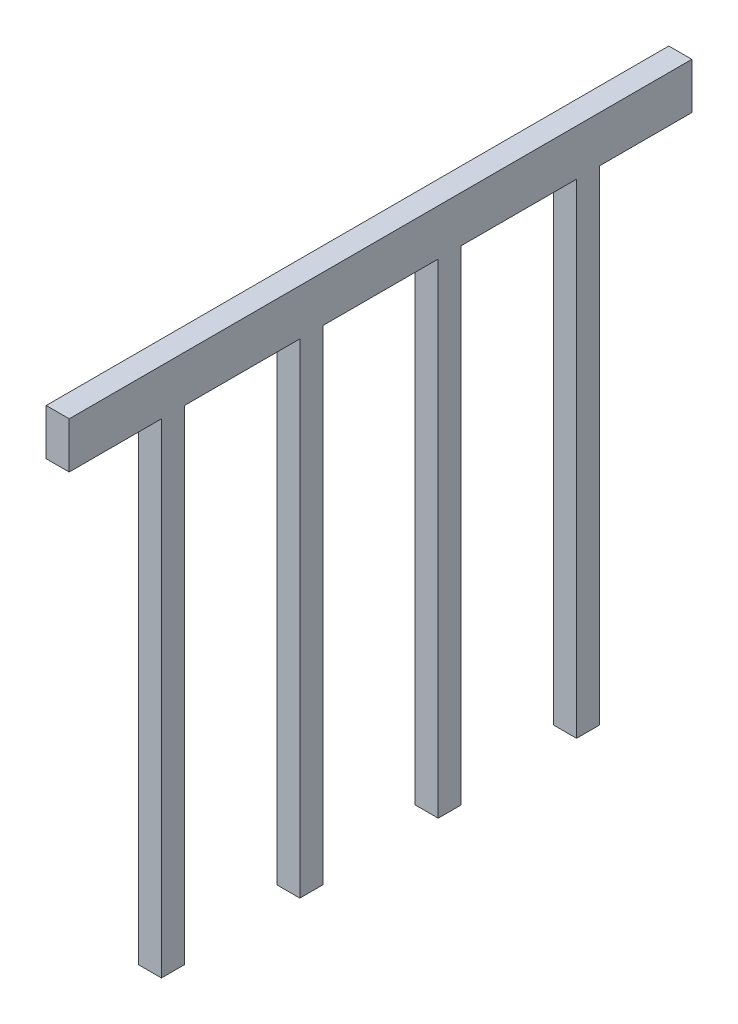
ISO-10303-21;
HEADER;
FILE_DESCRIPTION(('STEP AP214'),'2;1');
FILE_NAME('part.step','',(''),(''),'','','');
FILE_SCHEMA(('AUTOMOTIVE_DESIGN { 1 0 10303 214 1 1 1 1 }'));
ENDSEC;
DATA;
#1=APPLICATION_CONTEXT('core data for automotive mechanical design processes');
#2=APPLICATION_PROTOCOL_DEFINITION('international standard','automotive_design',2000,#1);
#3=PRODUCT_CONTEXT('',#1,'mechanical');
#4=PRODUCT('Part','Part','',(#3));
#5=PRODUCT_RELATED_PRODUCT_CATEGORY('part','',(#4));
#6=PRODUCT_DEFINITION_FORMATION('','',#4);
#7=PRODUCT_DEFINITION_CONTEXT('part definition',#1,'design');
#8=PRODUCT_DEFINITION('design','',#6,#7);
#9=PRODUCT_DEFINITION_SHAPE('','',#8);
#10=(LENGTH_UNIT() NAMED_UNIT(*) SI_UNIT(.MILLI.,.METRE.));
#11=(NAMED_UNIT(*) PLANE_ANGLE_UNIT() SI_UNIT($,.RADIAN.));
#12=(NAMED_UNIT(*) SI_UNIT($,.STERADIAN.) SOLID_ANGLE_UNIT());
#13=UNCERTAINTY_MEASURE_WITH_UNIT(LENGTH_MEASURE(1.E-05),#10,'distance_accuracy_value','');
#14=(GEOMETRIC_REPRESENTATION_CONTEXT(3) GLOBAL_UNCERTAINTY_ASSIGNED_CONTEXT((#13)) GLOBAL_UNIT_ASSIGNED_CONTEXT((#10,
#11,#12)) REPRESENTATION_CONTEXT('',''));
#15=CARTESIAN_POINT('',(0.,0.,0.));
#16=DIRECTION('',(0.,0.,1.));
#17=DIRECTION('',(1.,0.,0.));
#18=AXIS2_PLACEMENT_3D('',#15,#16,#17);
#19=CARTESIAN_POINT('',(25.4,584.2,342.9));
#20=DIRECTION('',(0.,0.,-1.));
#21=DIRECTION('',(0.,1.,0.));
#22=AXIS2_PLACEMENT_3D('',#19,#20,#21);
#23=PLANE('',#22);
#24=DIRECTION('',(0.,-1.,0.));
#25=VECTOR('',#24,1.);
#26=CARTESIAN_POINT('',(0.,584.2,342.9));
#27=LINE('',#26,#25);
#28=CARTESIAN_POINT('',(0.,584.2,342.9));
#29=VERTEX_POINT('',#28);
#30=CARTESIAN_POINT('',(0.,533.4,342.9));
#31=VERTEX_POINT('',#30);
#32=EDGE_CURVE('E200',#29,#31,#27,.T.);
#33=ORIENTED_EDGE('',*,*,#32,.T.);
#34=DIRECTION('',(-1.,0.,0.));
#35=VECTOR('',#34,1.);
#36=CARTESIAN_POINT('',(25.4,533.4,342.9));
#37=LINE('',#36,#35);
#38=CARTESIAN_POINT('',(25.4,533.4,342.9));
#39=VERTEX_POINT('',#38);
#40=EDGE_CURVE('E11',#39,#31,#37,.T.);
#41=ORIENTED_EDGE('',*,*,#40,.F.);
#42=DIRECTION('',(0.,-1.,0.));
#43=VECTOR('',#42,1.);
#44=CARTESIAN_POINT('',(25.4,584.2,342.9));
#45=LINE('',#44,#43);
#46=CARTESIAN_POINT('',(25.4,584.2,342.9));
#47=VERTEX_POINT('',#46);
#48=EDGE_CURVE('E238',#47,#39,#45,.T.);
#49=ORIENTED_EDGE('',*,*,#48,.F.);
#50=DIRECTION('',(-1.,0.,0.));
#51=VECTOR('',#50,1.);
#52=CARTESIAN_POINT('',(25.4,584.2,342.9));
#53=LINE('',#52,#51);
#54=EDGE_CURVE('E196',#47,#29,#53,.T.);
#55=ORIENTED_EDGE('',*,*,#54,.T.);
#56=EDGE_LOOP('',(#33,#41,#49,#55));
#57=FACE_BOUND('',#56,.T.);
#58=ADVANCED_FACE('F32',(#57),#23,.F.);
#59=CARTESIAN_POINT('',(25.4,533.4,342.9));
#60=DIRECTION('',(0.,1.,0.));
#61=DIRECTION('',(0.,0.,1.));
#62=AXIS2_PLACEMENT_3D('',#59,#60,#61);
#63=PLANE('',#62);
#64=DIRECTION('',(0.,0.,-1.));
#65=VECTOR('',#64,1.);
#66=CARTESIAN_POINT('',(0.,533.4,342.9));
#67=LINE('',#66,#65);
#68=CARTESIAN_POINT('',(0.,533.4,241.3));
#69=VERTEX_POINT('',#68);
#70=EDGE_CURVE('E203',#31,#69,#67,.T.);
#71=ORIENTED_EDGE('',*,*,#70,.T.);
#72=DIRECTION('',(-1.,0.,0.));
#73=VECTOR('',#72,1.);
#74=CARTESIAN_POINT('',(25.4,533.4,241.3));
#75=LINE('',#74,#73);
#76=CARTESIAN_POINT('',(25.4,533.4,241.3));
#77=VERTEX_POINT('',#76);
#78=EDGE_CURVE('E40',#77,#69,#75,.T.);
#79=ORIENTED_EDGE('',*,*,#78,.F.);
#80=DIRECTION('',(0.,0.,-1.));
#81=VECTOR('',#80,1.);
#82=CARTESIAN_POINT('',(25.4,533.4,342.9));
#83=LINE('',#82,#81);
#84=EDGE_CURVE('E127',#39,#77,#83,.T.);
#85=ORIENTED_EDGE('',*,*,#84,.F.);
#86=ORIENTED_EDGE('',*,*,#40,.T.);
#87=EDGE_LOOP('',(#71,#79,#85,#86));
#88=FACE_BOUND('',#87,.T.);
#89=ADVANCED_FACE('F356',(#88),#63,.F.);
#90=CARTESIAN_POINT('',(25.4,533.4,241.3));
#91=DIRECTION('',(0.,0.,-1.));
#92=DIRECTION('',(-1.,0.,0.));
#93=AXIS2_PLACEMENT_3D('',#90,#91,#92);
#94=PLANE('',#93);
#95=DIRECTION('',(0.,-1.,0.));
#96=VECTOR('',#95,1.);
#97=CARTESIAN_POINT('',(0.,533.4,241.3));
#98=LINE('',#97,#96);
#99=CARTESIAN_POINT('',(0.,0.,241.3));
#100=VERTEX_POINT('',#99);
#101=EDGE_CURVE('E205',#69,#100,#98,.T.);
#102=ORIENTED_EDGE('',*,*,#101,.T.);
#103=DIRECTION('',(-1.,0.,0.));
#104=VECTOR('',#103,1.);
#105=CARTESIAN_POINT('',(25.4,0.,241.3));
#106=LINE('',#105,#104);
#107=CARTESIAN_POINT('',(25.4,0.,241.3));
#108=VERTEX_POINT('',#107);
#109=EDGE_CURVE('E281',#108,#100,#106,.T.);
#110=ORIENTED_EDGE('',*,*,#109,.F.);
#111=DIRECTION('',(0.,-1.,0.));
#112=VECTOR('',#111,1.);
#113=CARTESIAN_POINT('',(25.4,533.4,241.3));
#114=LINE('',#113,#112);
#115=EDGE_CURVE('E289',#77,#108,#114,.T.);
#116=ORIENTED_EDGE('',*,*,#115,.F.);
#117=ORIENTED_EDGE('',*,*,#78,.T.);
#118=EDGE_LOOP('',(#102,#110,#116,#117));
#119=FACE_BOUND('',#118,.T.);
#120=ADVANCED_FACE('F287',(#119),#94,.F.);
#121=CARTESIAN_POINT('',(25.4,0.,241.3));
#122=DIRECTION('',(0.,1.,0.));
#123=DIRECTION('',(0.,0.,1.));
#124=AXIS2_PLACEMENT_3D('',#121,#122,#123);
#125=PLANE('',#124);
#126=DIRECTION('',(0.,0.,-1.));
#127=VECTOR('',#126,1.);
#128=CARTESIAN_POINT('',(0.,0.,241.3));
#129=LINE('',#128,#127);
#130=CARTESIAN_POINT('',(0.,0.,215.9));
#131=VERTEX_POINT('',#130);
#132=EDGE_CURVE('E207',#100,#131,#129,.T.);
#133=ORIENTED_EDGE('',*,*,#132,.T.);
#134=DIRECTION('',(-1.,0.,0.));
#135=VECTOR('',#134,1.);
#136=CARTESIAN_POINT('',(25.4,0.,215.9));
#137=LINE('',#136,#135);
#138=CARTESIAN_POINT('',(25.4,0.,215.9));
#139=VERTEX_POINT('',#138);
#140=EDGE_CURVE('E278',#139,#131,#137,.T.);
#141=ORIENTED_EDGE('',*,*,#140,.F.);
#142=DIRECTION('',(0.,0.,-1.));
#143=VECTOR('',#142,1.);
#144=CARTESIAN_POINT('',(25.4,0.,241.3));
#145=LINE('',#144,#143);
#146=EDGE_CURVE('E307',#108,#139,#145,.T.);
#147=ORIENTED_EDGE('',*,*,#146,.F.);
#148=ORIENTED_EDGE('',*,*,#109,.T.);
#149=EDGE_LOOP('',(#133,#141,#147,#148));
#150=FACE_BOUND('',#149,.T.);
#151=ADVANCED_FACE('F298',(#150),#125,.F.);
#152=CARTESIAN_POINT('',(25.4,533.4,215.9));
#153=DIRECTION('',(0.,0.,1.));
#154=DIRECTION('',(0.,-1.,0.));
#155=AXIS2_PLACEMENT_3D('',#152,#153,#154);
#156=PLANE('',#155);
#157=DIRECTION('',(0.,1.,0.));
#158=VECTOR('',#157,1.);
#159=CARTESIAN_POINT('',(0.,533.4,215.9));
#160=LINE('',#159,#158);
#161=CARTESIAN_POINT('',(0.,533.4,215.9));
#162=VERTEX_POINT('',#161);
#163=EDGE_CURVE('E209',#131,#162,#160,.T.);
#164=ORIENTED_EDGE('',*,*,#163,.T.);
#165=DIRECTION('',(-1.,0.,0.));
#166=VECTOR('',#165,1.);
#167=CARTESIAN_POINT('',(25.4,533.4,215.9));
#168=LINE('',#167,#166);
#169=CARTESIAN_POINT('',(25.4,533.4,215.9));
#170=VERTEX_POINT('',#169);
#171=EDGE_CURVE('E275',#170,#162,#168,.T.);
#172=ORIENTED_EDGE('',*,*,#171,.F.);
#173=DIRECTION('',(0.,1.,0.));
#174=VECTOR('',#173,1.);
#175=CARTESIAN_POINT('',(25.4,533.4,215.9));
#176=LINE('',#175,#174);
#177=EDGE_CURVE('E304',#139,#170,#176,.T.);
#178=ORIENTED_EDGE('',*,*,#177,.F.);
#179=ORIENTED_EDGE('',*,*,#140,.T.);
#180=EDGE_LOOP('',(#164,#172,#178,#179));
#181=FACE_BOUND('',#180,.T.);
#182=ADVANCED_FACE('F302',(#181),#156,.F.);
#183=CARTESIAN_POINT('',(25.4,533.4,215.9));
#184=DIRECTION('',(0.,1.,0.));
#185=DIRECTION('',(0.,0.,1.));
#186=AXIS2_PLACEMENT_3D('',#183,#184,#185);
#187=PLANE('',#186);
#188=DIRECTION('',(0.,0.,-1.));
#189=VECTOR('',#188,1.);
#190=CARTESIAN_POINT('',(0.,533.4,215.9));
#191=LINE('',#190,#189);
#192=CARTESIAN_POINT('',(0.,533.4,88.9));
#193=VERTEX_POINT('',#192);
#194=EDGE_CURVE('E211',#162,#193,#191,.T.);
#195=ORIENTED_EDGE('',*,*,#194,.T.);
#196=DIRECTION('',(-1.,0.,0.));
#197=VECTOR('',#196,1.);
#198=CARTESIAN_POINT('',(25.4,533.4,88.9));
#199=LINE('',#198,#197);
#200=CARTESIAN_POINT('',(25.4,533.4,88.9));
#201=VERTEX_POINT('',#200);
#202=EDGE_CURVE('E272',#201,#193,#199,.T.);
#203=ORIENTED_EDGE('',*,*,#202,.F.);
#204=DIRECTION('',(0.,0.,-1.));
#205=VECTOR('',#204,1.);
#206=CARTESIAN_POINT('',(25.4,533.4,215.9));
#207=LINE('',#206,#205);
#208=EDGE_CURVE('E306',#170,#201,#207,.T.);
#209=ORIENTED_EDGE('',*,*,#208,.F.);
#210=ORIENTED_EDGE('',*,*,#171,.T.);
#211=EDGE_LOOP('',(#195,#203,#209,#210));
#212=FACE_BOUND('',#211,.T.);
#213=ADVANCED_FACE('F369',(#212),#187,.F.);
#214=CARTESIAN_POINT('',(25.4,533.4,88.9));
#215=DIRECTION('',(0.,0.,-1.));
#216=DIRECTION('',(-1.,0.,0.));
#217=AXIS2_PLACEMENT_3D('',#214,#215,#216);
#218=PLANE('',#217);
#219=DIRECTION('',(0.,-1.,0.));
#220=VECTOR('',#219,1.);
#221=CARTESIAN_POINT('',(0.,533.4,88.9));
#222=LINE('',#221,#220);
#223=CARTESIAN_POINT('',(0.,0.,88.9));
#224=VERTEX_POINT('',#223);
#225=EDGE_CURVE('E213',#193,#224,#222,.T.);
#226=ORIENTED_EDGE('',*,*,#225,.T.);
#227=DIRECTION('',(-1.,0.,0.));
#228=VECTOR('',#227,1.);
#229=CARTESIAN_POINT('',(25.4,0.,88.9));
#230=LINE('',#229,#228);
#231=CARTESIAN_POINT('',(25.4,0.,88.9));
#232=VERTEX_POINT('',#231);
#233=EDGE_CURVE('E269',#232,#224,#230,.T.);
#234=ORIENTED_EDGE('',*,*,#233,.F.);
#235=DIRECTION('',(0.,-1.,0.));
#236=VECTOR('',#235,1.);
#237=CARTESIAN_POINT('',(25.4,533.4,88.9));
#238=LINE('',#237,#236);
#239=EDGE_CURVE('E309',#201,#232,#238,.T.);
#240=ORIENTED_EDGE('',*,*,#239,.F.);
#241=ORIENTED_EDGE('',*,*,#202,.T.);
#242=EDGE_LOOP('',(#226,#234,#240,#241));
#243=FACE_BOUND('',#242,.T.);
#244=ADVANCED_FACE('F372',(#243),#218,.F.);
#245=CARTESIAN_POINT('',(25.4,0.,88.9));
#246=DIRECTION('',(0.,1.,0.));
#247=DIRECTION('',(0.,0.,1.));
#248=AXIS2_PLACEMENT_3D('',#245,#246,#247);
#249=PLANE('',#248);
#250=DIRECTION('',(0.,0.,-1.));
#251=VECTOR('',#250,1.);
#252=CARTESIAN_POINT('',(0.,0.,88.9));
#253=LINE('',#252,#251);
#254=CARTESIAN_POINT('',(0.,0.,63.5));
#255=VERTEX_POINT('',#254);
#256=EDGE_CURVE('E215',#224,#255,#253,.T.);
#257=ORIENTED_EDGE('',*,*,#256,.T.);
#258=DIRECTION('',(-1.,0.,0.));
#259=VECTOR('',#258,1.);
#260=CARTESIAN_POINT('',(25.4,0.,63.5));
#261=LINE('',#260,#259);
#262=CARTESIAN_POINT('',(25.4,0.,63.5));
#263=VERTEX_POINT('',#262);
#264=EDGE_CURVE('E266',#263,#255,#261,.T.);
#265=ORIENTED_EDGE('',*,*,#264,.F.);
#266=DIRECTION('',(0.,0.,-1.));
#267=VECTOR('',#266,1.);
#268=CARTESIAN_POINT('',(25.4,0.,88.9));
#269=LINE('',#268,#267);
#270=EDGE_CURVE('E315',#232,#263,#269,.T.);
#271=ORIENTED_EDGE('',*,*,#270,.F.);
#272=ORIENTED_EDGE('',*,*,#233,.T.);
#273=EDGE_LOOP('',(#257,#265,#271,#272));
#274=FACE_BOUND('',#273,.T.);
#275=ADVANCED_FACE('F376',(#274),#249,.F.);
#276=CARTESIAN_POINT('',(25.4,533.4,63.5));
#277=DIRECTION('',(0.,0.,1.));
#278=DIRECTION('',(0.,-1.,0.));
#279=AXIS2_PLACEMENT_3D('',#276,#277,#278);
#280=PLANE('',#279);
#281=DIRECTION('',(0.,1.,0.));
#282=VECTOR('',#281,1.);
#283=CARTESIAN_POINT('',(0.,533.4,63.5));
#284=LINE('',#283,#282);
#285=CARTESIAN_POINT('',(0.,533.4,63.5));
#286=VERTEX_POINT('',#285);
#287=EDGE_CURVE('E217',#255,#286,#284,.T.);
#288=ORIENTED_EDGE('',*,*,#287,.T.);
#289=DIRECTION('',(-1.,0.,0.));
#290=VECTOR('',#289,1.);
#291=CARTESIAN_POINT('',(25.4,533.4,63.5));
#292=LINE('',#291,#290);
#293=CARTESIAN_POINT('',(25.4,533.4,63.5));
#294=VERTEX_POINT('',#293);
#295=EDGE_CURVE('E263',#294,#286,#292,.T.);
#296=ORIENTED_EDGE('',*,*,#295,.F.);
#297=DIRECTION('',(0.,1.,0.));
#298=VECTOR('',#297,1.);
#299=CARTESIAN_POINT('',(25.4,533.4,63.5));
#300=LINE('',#299,#298);
#301=EDGE_CURVE('E317',#263,#294,#300,.T.);
#302=ORIENTED_EDGE('',*,*,#301,.F.);
#303=ORIENTED_EDGE('',*,*,#264,.T.);
#304=EDGE_LOOP('',(#288,#296,#302,#303));
#305=FACE_BOUND('',#304,.T.);
#306=ADVANCED_FACE('F380',(#305),#280,.F.);
#307=CARTESIAN_POINT('',(25.4,533.4,63.5));
#308=DIRECTION('',(0.,1.,0.));
#309=DIRECTION('',(0.,0.,1.));
#310=AXIS2_PLACEMENT_3D('',#307,#308,#309);
#311=PLANE('',#310);
#312=DIRECTION('',(0.,0.,-1.));
#313=VECTOR('',#312,1.);
#314=CARTESIAN_POINT('',(0.,533.4,63.5));
#315=LINE('',#314,#313);
#316=CARTESIAN_POINT('',(0.,533.4,-63.5));
#317=VERTEX_POINT('',#316);
#318=EDGE_CURVE('E219',#286,#317,#315,.T.);
#319=ORIENTED_EDGE('',*,*,#318,.T.);
#320=DIRECTION('',(-1.,0.,0.));
#321=VECTOR('',#320,1.);
#322=CARTESIAN_POINT('',(25.4,533.4,-63.5));
#323=LINE('',#322,#321);
#324=CARTESIAN_POINT('',(25.4,533.4,-63.5));
#325=VERTEX_POINT('',#324);
#326=EDGE_CURVE('E260',#325,#317,#323,.T.);
#327=ORIENTED_EDGE('',*,*,#326,.F.);
#328=DIRECTION('',(0.,0.,-1.));
#329=VECTOR('',#328,1.);
#330=CARTESIAN_POINT('',(25.4,533.4,63.5));
#331=LINE('',#330,#329);
#332=EDGE_CURVE('E319',#294,#325,#331,.T.);
#333=ORIENTED_EDGE('',*,*,#332,.F.);
#334=ORIENTED_EDGE('',*,*,#295,.T.);
#335=EDGE_LOOP('',(#319,#327,#333,#334));
#336=FACE_BOUND('',#335,.T.);
#337=ADVANCED_FACE('F384',(#336),#311,.F.);
#338=CARTESIAN_POINT('',(25.4,533.4,-63.5));
#339=DIRECTION('',(0.,0.,-1.));
#340=DIRECTION('',(-1.,0.,0.));
#341=AXIS2_PLACEMENT_3D('',#338,#339,#340);
#342=PLANE('',#341);
#343=DIRECTION('',(0.,-1.,0.));
#344=VECTOR('',#343,1.);
#345=CARTESIAN_POINT('',(0.,533.4,-63.5));
#346=LINE('',#345,#344);
#347=CARTESIAN_POINT('',(0.,0.,-63.5));
#348=VERTEX_POINT('',#347);
#349=EDGE_CURVE('E221',#317,#348,#346,.T.);
#350=ORIENTED_EDGE('',*,*,#349,.T.);
#351=DIRECTION('',(-1.,0.,0.));
#352=VECTOR('',#351,1.);
#353=CARTESIAN_POINT('',(25.4,0.,-63.5));
#354=LINE('',#353,#352);
#355=CARTESIAN_POINT('',(25.4,0.,-63.5));
#356=VERTEX_POINT('',#355);
#357=EDGE_CURVE('E257',#356,#348,#354,.T.);
#358=ORIENTED_EDGE('',*,*,#357,.F.);
#359=DIRECTION('',(0.,-1.,0.));
#360=VECTOR('',#359,1.);
#361=CARTESIAN_POINT('',(25.4,533.4,-63.5));
#362=LINE('',#361,#360);
#363=EDGE_CURVE('E321',#325,#356,#362,.T.);
#364=ORIENTED_EDGE('',*,*,#363,.F.);
#365=ORIENTED_EDGE('',*,*,#326,.T.);
#366=EDGE_LOOP('',(#350,#358,#364,#365));
#367=FACE_BOUND('',#366,.T.);
#368=ADVANCED_FACE('F388',(#367),#342,.F.);
#369=CARTESIAN_POINT('',(25.4,0.,-63.5));
#370=DIRECTION('',(0.,1.,0.));
#371=DIRECTION('',(0.,0.,1.));
#372=AXIS2_PLACEMENT_3D('',#369,#370,#371);
#373=PLANE('',#372);
#374=DIRECTION('',(0.,0.,-1.));
#375=VECTOR('',#374,1.);
#376=CARTESIAN_POINT('',(0.,0.,-63.5));
#377=LINE('',#376,#375);
#378=CARTESIAN_POINT('',(0.,0.,-88.9));
#379=VERTEX_POINT('',#378);
#380=EDGE_CURVE('E223',#348,#379,#377,.T.);
#381=ORIENTED_EDGE('',*,*,#380,.T.);
#382=DIRECTION('',(-1.,0.,0.));
#383=VECTOR('',#382,1.);
#384=CARTESIAN_POINT('',(25.4,0.,-88.9));
#385=LINE('',#384,#383);
#386=CARTESIAN_POINT('',(25.4,0.,-88.9));
#387=VERTEX_POINT('',#386);
#388=EDGE_CURVE('E254',#387,#379,#385,.T.);
#389=ORIENTED_EDGE('',*,*,#388,.F.);
#390=DIRECTION('',(0.,0.,-1.));
#391=VECTOR('',#390,1.);
#392=CARTESIAN_POINT('',(25.4,0.,-63.5));
#393=LINE('',#392,#391);
#394=EDGE_CURVE('E323',#356,#387,#393,.T.);
#395=ORIENTED_EDGE('',*,*,#394,.F.);
#396=ORIENTED_EDGE('',*,*,#357,.T.);
#397=EDGE_LOOP('',(#381,#389,#395,#396));
#398=FACE_BOUND('',#397,.T.);
#399=ADVANCED_FACE('F392',(#398),#373,.F.);
#400=CARTESIAN_POINT('',(25.4,533.4,-88.9));
#401=DIRECTION('',(0.,0.,1.));
#402=DIRECTION('',(0.,-1.,0.));
#403=AXIS2_PLACEMENT_3D('',#400,#401,#402);
#404=PLANE('',#403);
#405=DIRECTION('',(0.,1.,0.));
#406=VECTOR('',#405,1.);
#407=CARTESIAN_POINT('',(0.,533.4,-88.9));
#408=LINE('',#407,#406);
#409=CARTESIAN_POINT('',(0.,533.4,-88.9));
#410=VERTEX_POINT('',#409);
#411=EDGE_CURVE('E225',#379,#410,#408,.T.);
#412=ORIENTED_EDGE('',*,*,#411,.T.);
#413=DIRECTION('',(-1.,0.,0.));
#414=VECTOR('',#413,1.);
#415=CARTESIAN_POINT('',(25.4,533.4,-88.9));
#416=LINE('',#415,#414);
#417=CARTESIAN_POINT('',(25.4,533.4,-88.9));
#418=VERTEX_POINT('',#417);
#419=EDGE_CURVE('E251',#418,#410,#416,.T.);
#420=ORIENTED_EDGE('',*,*,#419,.F.);
#421=DIRECTION('',(0.,1.,0.));
#422=VECTOR('',#421,1.);
#423=CARTESIAN_POINT('',(25.4,533.4,-88.9));
#424=LINE('',#423,#422);
#425=EDGE_CURVE('E325',#387,#418,#424,.T.);
#426=ORIENTED_EDGE('',*,*,#425,.F.);
#427=ORIENTED_EDGE('',*,*,#388,.T.);
#428=EDGE_LOOP('',(#412,#420,#426,#427));
#429=FACE_BOUND('',#428,.T.);
#430=ADVANCED_FACE('F396',(#429),#404,.F.);
#431=CARTESIAN_POINT('',(25.4,533.4,-88.9));
#432=DIRECTION('',(0.,1.,0.));
#433=DIRECTION('',(0.,0.,1.));
#434=AXIS2_PLACEMENT_3D('',#431,#432,#433);
#435=PLANE('',#434);
#436=DIRECTION('',(0.,0.,-1.));
#437=VECTOR('',#436,1.);
#438=CARTESIAN_POINT('',(0.,533.4,-88.9));
#439=LINE('',#438,#437);
#440=CARTESIAN_POINT('',(0.,533.4,-215.9));
#441=VERTEX_POINT('',#440);
#442=EDGE_CURVE('E227',#410,#441,#439,.T.);
#443=ORIENTED_EDGE('',*,*,#442,.T.);
#444=DIRECTION('',(-1.,0.,0.));
#445=VECTOR('',#444,1.);
#446=CARTESIAN_POINT('',(25.4,533.4,-215.9));
#447=LINE('',#446,#445);
#448=CARTESIAN_POINT('',(25.4,533.4,-215.9));
#449=VERTEX_POINT('',#448);
#450=EDGE_CURVE('E248',#449,#441,#447,.T.);
#451=ORIENTED_EDGE('',*,*,#450,.F.);
#452=DIRECTION('',(0.,0.,-1.));
#453=VECTOR('',#452,1.);
#454=CARTESIAN_POINT('',(25.4,533.4,-88.9));
#455=LINE('',#454,#453);
#456=EDGE_CURVE('E327',#418,#449,#455,.T.);
#457=ORIENTED_EDGE('',*,*,#456,.F.);
#458=ORIENTED_EDGE('',*,*,#419,.T.);
#459=EDGE_LOOP('',(#443,#451,#457,#458));
#460=FACE_BOUND('',#459,.T.);
#461=ADVANCED_FACE('F400',(#460),#435,.F.);
#462=CARTESIAN_POINT('',(25.4,533.4,-215.9));
#463=DIRECTION('',(0.,0.,-1.));
#464=DIRECTION('',(-1.,0.,0.));
#465=AXIS2_PLACEMENT_3D('',#462,#463,#464);
#466=PLANE('',#465);
#467=DIRECTION('',(0.,-1.,0.));
#468=VECTOR('',#467,1.);
#469=CARTESIAN_POINT('',(0.,533.4,-215.9));
#470=LINE('',#469,#468);
#471=CARTESIAN_POINT('',(0.,0.,-215.9));
#472=VERTEX_POINT('',#471);
#473=EDGE_CURVE('E229',#441,#472,#470,.T.);
#474=ORIENTED_EDGE('',*,*,#473,.T.);
#475=DIRECTION('',(-1.,0.,0.));
#476=VECTOR('',#475,1.);
#477=CARTESIAN_POINT('',(25.4,0.,-215.9));
#478=LINE('',#477,#476);
#479=CARTESIAN_POINT('',(25.4,0.,-215.9));
#480=VERTEX_POINT('',#479);
#481=EDGE_CURVE('E245',#480,#472,#478,.T.);
#482=ORIENTED_EDGE('',*,*,#481,.F.);
#483=DIRECTION('',(0.,-1.,0.));
#484=VECTOR('',#483,1.);
#485=CARTESIAN_POINT('',(25.4,533.4,-215.9));
#486=LINE('',#485,#484);
#487=EDGE_CURVE('E329',#449,#480,#486,.T.);
#488=ORIENTED_EDGE('',*,*,#487,.F.);
#489=ORIENTED_EDGE('',*,*,#450,.T.);
#490=EDGE_LOOP('',(#474,#482,#488,#489));
#491=FACE_BOUND('',#490,.T.);
#492=ADVANCED_FACE('F404',(#491),#466,.F.);
#493=CARTESIAN_POINT('',(25.4,0.,-215.9));
#494=DIRECTION('',(0.,1.,0.));
#495=DIRECTION('',(0.,0.,1.));
#496=AXIS2_PLACEMENT_3D('',#493,#494,#495);
#497=PLANE('',#496);
#498=DIRECTION('',(0.,0.,-1.));
#499=VECTOR('',#498,1.);
#500=CARTESIAN_POINT('',(0.,0.,-215.9));
#501=LINE('',#500,#499);
#502=CARTESIAN_POINT('',(0.,0.,-241.3));
#503=VERTEX_POINT('',#502);
#504=EDGE_CURVE('E231',#472,#503,#501,.T.);
#505=ORIENTED_EDGE('',*,*,#504,.T.);
#506=DIRECTION('',(-1.,0.,0.));
#507=VECTOR('',#506,1.);
#508=CARTESIAN_POINT('',(25.4,0.,-241.3));
#509=LINE('',#508,#507);
#510=CARTESIAN_POINT('',(25.4,0.,-241.3));
#511=VERTEX_POINT('',#510);
#512=EDGE_CURVE('E242',#511,#503,#509,.T.);
#513=ORIENTED_EDGE('',*,*,#512,.F.);
#514=DIRECTION('',(0.,0.,-1.));
#515=VECTOR('',#514,1.);
#516=CARTESIAN_POINT('',(25.4,0.,-215.9));
#517=LINE('',#516,#515);
#518=EDGE_CURVE('E331',#480,#511,#517,.T.);
#519=ORIENTED_EDGE('',*,*,#518,.F.);
#520=ORIENTED_EDGE('',*,*,#481,.T.);
#521=EDGE_LOOP('',(#505,#513,#519,#520));
#522=FACE_BOUND('',#521,.T.);
#523=ADVANCED_FACE('F337',(#522),#497,.F.);
#524=CARTESIAN_POINT('',(25.4,533.4,-241.3));
#525=DIRECTION('',(0.,0.,1.));
#526=DIRECTION('',(0.,-1.,0.));
#527=AXIS2_PLACEMENT_3D('',#524,#525,#526);
#528=PLANE('',#527);
#529=DIRECTION('',(0.,1.,0.));
#530=VECTOR('',#529,1.);
#531=CARTESIAN_POINT('',(0.,533.4,-241.3));
#532=LINE('',#531,#530);
#533=CARTESIAN_POINT('',(0.,533.4,-241.3));
#534=VERTEX_POINT('',#533);
#535=EDGE_CURVE('E233',#503,#534,#532,.T.);
#536=ORIENTED_EDGE('',*,*,#535,.T.);
#537=DIRECTION('',(-1.,0.,0.));
#538=VECTOR('',#537,1.);
#539=CARTESIAN_POINT('',(25.4,533.4,-241.3));
#540=LINE('',#539,#538);
#541=CARTESIAN_POINT('',(25.4,533.4,-241.3));
#542=VERTEX_POINT('',#541);
#543=EDGE_CURVE('E191',#542,#534,#540,.T.);
#544=ORIENTED_EDGE('',*,*,#543,.F.);
#545=DIRECTION('',(0.,1.,0.));
#546=VECTOR('',#545,1.);
#547=CARTESIAN_POINT('',(25.4,533.4,-241.3));
#548=LINE('',#547,#546);
#549=EDGE_CURVE('E182',#511,#542,#548,.T.);
#550=ORIENTED_EDGE('',*,*,#549,.F.);
#551=ORIENTED_EDGE('',*,*,#512,.T.);
#552=EDGE_LOOP('',(#536,#544,#550,#551));
#553=FACE_BOUND('',#552,.T.);
#554=ADVANCED_FACE('F341',(#553),#528,.F.);
#555=CARTESIAN_POINT('',(25.4,533.4,-241.3));
#556=DIRECTION('',(0.,1.,0.));
#557=DIRECTION('',(0.,0.,1.));
#558=AXIS2_PLACEMENT_3D('',#555,#556,#557);
#559=PLANE('',#558);
#560=DIRECTION('',(0.,0.,-1.));
#561=VECTOR('',#560,1.);
#562=CARTESIAN_POINT('',(0.,533.4,-241.3));
#563=LINE('',#562,#561);
#564=CARTESIAN_POINT('',(0.,533.4,-342.9));
#565=VERTEX_POINT('',#564);
#566=EDGE_CURVE('E190',#534,#565,#563,.T.);
#567=ORIENTED_EDGE('',*,*,#566,.T.);
#568=DIRECTION('',(-1.,0.,0.));
#569=VECTOR('',#568,1.);
#570=CARTESIAN_POINT('',(25.4,533.4,-342.9));
#571=LINE('',#570,#569);
#572=CARTESIAN_POINT('',(25.4,533.4,-342.9));
#573=VERTEX_POINT('',#572);
#574=EDGE_CURVE('E187',#573,#565,#571,.T.);
#575=ORIENTED_EDGE('',*,*,#574,.F.);
#576=DIRECTION('',(0.,0.,-1.));
#577=VECTOR('',#576,1.);
#578=CARTESIAN_POINT('',(25.4,533.4,-241.3));
#579=LINE('',#578,#577);
#580=EDGE_CURVE('E176',#542,#573,#579,.T.);
#581=ORIENTED_EDGE('',*,*,#580,.F.);
#582=ORIENTED_EDGE('',*,*,#543,.T.);
#583=EDGE_LOOP('',(#567,#575,#581,#582));
#584=FACE_BOUND('',#583,.T.);
#585=ADVANCED_FACE('F188',(#584),#559,.F.);
#586=CARTESIAN_POINT('',(25.4,584.2,-342.9));
#587=DIRECTION('',(0.,0.,1.));
#588=DIRECTION('',(0.,-1.,0.));
#589=AXIS2_PLACEMENT_3D('',#586,#587,#588);
#590=PLANE('',#589);
#591=DIRECTION('',(0.,1.,0.));
#592=VECTOR('',#591,1.);
#593=CARTESIAN_POINT('',(0.,584.2,-342.9));
#594=LINE('',#593,#592);
#595=CARTESIAN_POINT('',(0.,584.2,-342.9));
#596=VERTEX_POINT('',#595);
#597=EDGE_CURVE('E113',#565,#596,#594,.T.);
#598=ORIENTED_EDGE('',*,*,#597,.T.);
#599=DIRECTION('',(-1.,0.,0.));
#600=VECTOR('',#599,1.);
#601=CARTESIAN_POINT('',(25.4,584.2,-342.9));
#602=LINE('',#601,#600);
#603=CARTESIAN_POINT('',(25.4,584.2,-342.9));
#604=VERTEX_POINT('',#603);
#605=EDGE_CURVE('E192',#604,#596,#602,.T.);
#606=ORIENTED_EDGE('',*,*,#605,.F.);
#607=DIRECTION('',(0.,1.,0.));
#608=VECTOR('',#607,1.);
#609=CARTESIAN_POINT('',(25.4,584.2,-342.9));
#610=LINE('',#609,#608);
#611=EDGE_CURVE('E180',#573,#604,#610,.T.);
#612=ORIENTED_EDGE('',*,*,#611,.F.);
#613=ORIENTED_EDGE('',*,*,#574,.T.);
#614=EDGE_LOOP('',(#598,#606,#612,#613));
#615=FACE_BOUND('',#614,.T.);
#616=ADVANCED_FACE('F194',(#615),#590,.F.);
#617=CARTESIAN_POINT('',(25.4,584.2,342.9));
#618=DIRECTION('',(0.,-1.,0.));
#619=DIRECTION('',(0.,0.,-1.));
#620=AXIS2_PLACEMENT_3D('',#617,#618,#619);
#621=PLANE('',#620);
#622=DIRECTION('',(0.,0.,1.));
#623=VECTOR('',#622,1.);
#624=CARTESIAN_POINT('',(0.,584.2,342.9));
#625=LINE('',#624,#623);
#626=EDGE_CURVE('E119',#596,#29,#625,.T.);
#627=ORIENTED_EDGE('',*,*,#626,.T.);
#628=ORIENTED_EDGE('',*,*,#54,.F.);
#629=DIRECTION('',(0.,0.,1.));
#630=VECTOR('',#629,1.);
#631=CARTESIAN_POINT('',(25.4,584.2,342.9));
#632=LINE('',#631,#630);
#633=EDGE_CURVE('E48',#604,#47,#632,.T.);
#634=ORIENTED_EDGE('',*,*,#633,.F.);
#635=ORIENTED_EDGE('',*,*,#605,.T.);
#636=EDGE_LOOP('',(#627,#628,#634,#635));
#637=FACE_BOUND('',#636,.T.);
#638=ADVANCED_FACE('F345',(#637),#621,.F.);
#639=CARTESIAN_POINT('',(25.4,0.,0.));
#640=DIRECTION('',(1.,0.,0.));
#641=DIRECTION('',(0.,0.,-1.));
#642=AXIS2_PLACEMENT_3D('',#639,#640,#641);
#643=PLANE('',#642);
#644=ORIENTED_EDGE('',*,*,#48,.T.);
#645=ORIENTED_EDGE('',*,*,#84,.T.);
#646=ORIENTED_EDGE('',*,*,#115,.T.);
#647=ORIENTED_EDGE('',*,*,#146,.T.);
#648=ORIENTED_EDGE('',*,*,#177,.T.);
#649=ORIENTED_EDGE('',*,*,#208,.T.);
#650=ORIENTED_EDGE('',*,*,#239,.T.);
#651=ORIENTED_EDGE('',*,*,#270,.T.);
#652=ORIENTED_EDGE('',*,*,#301,.T.);
#653=ORIENTED_EDGE('',*,*,#332,.T.);
#654=ORIENTED_EDGE('',*,*,#363,.T.);
#655=ORIENTED_EDGE('',*,*,#394,.T.);
#656=ORIENTED_EDGE('',*,*,#425,.T.);
#657=ORIENTED_EDGE('',*,*,#456,.T.);
#658=ORIENTED_EDGE('',*,*,#487,.T.);
#659=ORIENTED_EDGE('',*,*,#518,.T.);
#660=ORIENTED_EDGE('',*,*,#549,.T.);
#661=ORIENTED_EDGE('',*,*,#580,.T.);
#662=ORIENTED_EDGE('',*,*,#611,.T.);
#663=ORIENTED_EDGE('',*,*,#633,.T.);
#664=EDGE_LOOP('',(#644,#645,#646,#647,#648,#649,#650,#651,#652,#653,#654,#655,#656,#657,#658,
#659,#660,#661,#662,#663));
#665=FACE_BOUND('',#664,.T.);
#666=ADVANCED_FACE('F178',(#665),#643,.T.);
#667=CARTESIAN_POINT('',(0.,0.,0.));
#668=DIRECTION('',(1.,0.,0.));
#669=DIRECTION('',(0.,0.,-1.));
#670=AXIS2_PLACEMENT_3D('',#667,#668,#669);
#671=PLANE('',#670);
#672=ORIENTED_EDGE('',*,*,#32,.F.);
#673=ORIENTED_EDGE('',*,*,#626,.F.);
#674=ORIENTED_EDGE('',*,*,#597,.F.);
#675=ORIENTED_EDGE('',*,*,#566,.F.);
#676=ORIENTED_EDGE('',*,*,#535,.F.);
#677=ORIENTED_EDGE('',*,*,#504,.F.);
#678=ORIENTED_EDGE('',*,*,#473,.F.);
#679=ORIENTED_EDGE('',*,*,#442,.F.);
#680=ORIENTED_EDGE('',*,*,#411,.F.);
#681=ORIENTED_EDGE('',*,*,#380,.F.);
#682=ORIENTED_EDGE('',*,*,#349,.F.);
#683=ORIENTED_EDGE('',*,*,#318,.F.);
#684=ORIENTED_EDGE('',*,*,#287,.F.);
#685=ORIENTED_EDGE('',*,*,#256,.F.);
#686=ORIENTED_EDGE('',*,*,#225,.F.);
#687=ORIENTED_EDGE('',*,*,#194,.F.);
#688=ORIENTED_EDGE('',*,*,#163,.F.);
#689=ORIENTED_EDGE('',*,*,#132,.F.);
#690=ORIENTED_EDGE('',*,*,#101,.F.);
#691=ORIENTED_EDGE('',*,*,#70,.F.);
#692=EDGE_LOOP('',(#672,#673,#674,#675,#676,#677,#678,#679,#680,#681,#682,#683,#684,#685,#686,
#687,#688,#689,#690,#691));
#693=FACE_BOUND('',#692,.T.);
#694=ADVANCED_FACE('F293',(#693),#671,.F.);
#695=CLOSED_SHELL('',(#58,#89,#120,#151,#182,#213,#244,#275,#306,#337,#368,#399,#430,#461,#492,
#523,#554,#585,#616,#638,#666,#694));
#696=MANIFOLD_SOLID_BREP('B2',#695);
#697=ADVANCED_BREP_SHAPE_REPRESENTATION('',(#18,#696),#14);
#698=SHAPE_DEFINITION_REPRESENTATION(#9,#697);
ENDSEC;
END-ISO-10303-21;
